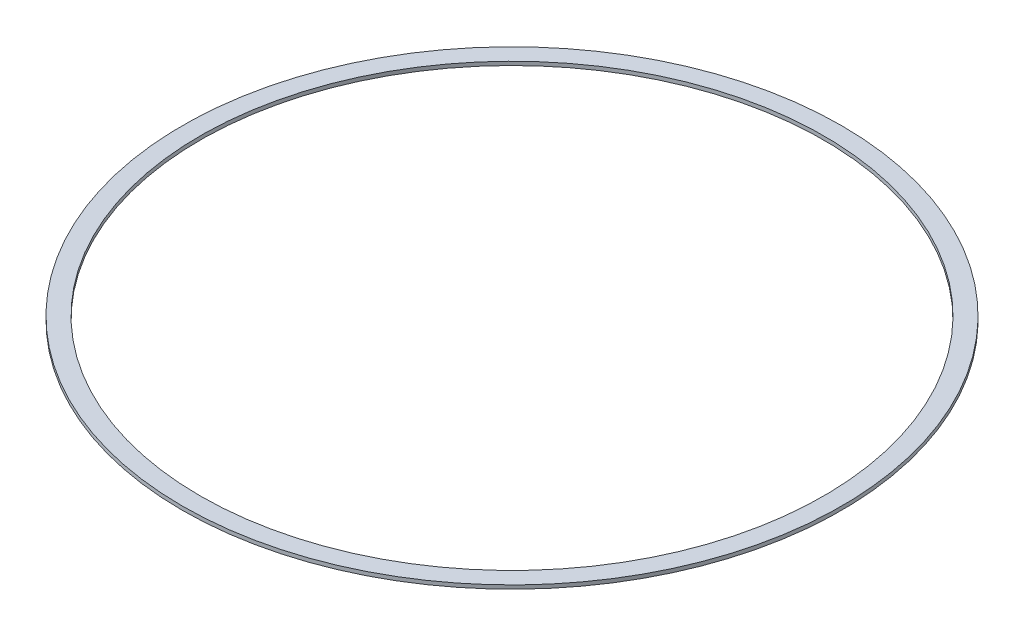
ISO-10303-21;
HEADER;
FILE_DESCRIPTION(('STEP AP214'),'2;1');
FILE_NAME('part.step','',(''),(''),'','','');
FILE_SCHEMA(('AUTOMOTIVE_DESIGN { 1 0 10303 214 1 1 1 1 }'));
ENDSEC;
DATA;
#1=APPLICATION_CONTEXT('core data for automotive mechanical design processes');
#2=APPLICATION_PROTOCOL_DEFINITION('international standard','automotive_design',2000,#1);
#3=PRODUCT_CONTEXT('',#1,'mechanical');
#4=PRODUCT('Part','Part','',(#3));
#5=PRODUCT_RELATED_PRODUCT_CATEGORY('part','',(#4));
#6=PRODUCT_DEFINITION_FORMATION('','',#4);
#7=PRODUCT_DEFINITION_CONTEXT('part definition',#1,'design');
#8=PRODUCT_DEFINITION('design','',#6,#7);
#9=PRODUCT_DEFINITION_SHAPE('','',#8);
#10=(LENGTH_UNIT() NAMED_UNIT(*) SI_UNIT(.MILLI.,.METRE.));
#11=(NAMED_UNIT(*) PLANE_ANGLE_UNIT() SI_UNIT($,.RADIAN.));
#12=(NAMED_UNIT(*) SI_UNIT($,.STERADIAN.) SOLID_ANGLE_UNIT());
#13=UNCERTAINTY_MEASURE_WITH_UNIT(LENGTH_MEASURE(1.E-05),#10,'distance_accuracy_value','');
#14=(GEOMETRIC_REPRESENTATION_CONTEXT(3) GLOBAL_UNCERTAINTY_ASSIGNED_CONTEXT((#13)) GLOBAL_UNIT_ASSIGNED_CONTEXT((#10,
#11,#12)) REPRESENTATION_CONTEXT('',''));
#15=CARTESIAN_POINT('',(0.,0.,0.));
#16=DIRECTION('',(0.,0.,1.));
#17=DIRECTION('',(1.,0.,0.));
#18=AXIS2_PLACEMENT_3D('',#15,#16,#17);
#19=CARTESIAN_POINT('',(0.,2.54,0.));
#20=DIRECTION('',(0.,1.,0.));
#21=DIRECTION('',(0.,0.,1.));
#22=AXIS2_PLACEMENT_3D('',#19,#20,#21);
#23=PLANE('',#22);
#24=CARTESIAN_POINT('',(0.,2.54,0.));
#25=DIRECTION('',(0.,1.,0.));
#26=DIRECTION('',(0.,0.,1.));
#27=AXIS2_PLACEMENT_3D('',#24,#25,#26);
#28=CIRCLE('',#27,224.9678);
#29=CARTESIAN_POINT('',(0.,2.54,224.9678));
#30=VERTEX_POINT('',#29);
#31=EDGE_CURVE('E10',#30,#30,#28,.T.);
#32=ORIENTED_EDGE('',*,*,#31,.T.);
#33=EDGE_LOOP('',(#32));
#34=FACE_BOUND('',#33,.T.);
#35=CARTESIAN_POINT('',(0.,2.54,0.));
#36=DIRECTION('',(0.,1.,0.));
#37=DIRECTION('',(0.,0.,1.));
#38=AXIS2_PLACEMENT_3D('',#35,#36,#37);
#39=CIRCLE('',#38,212.8774);
#40=CARTESIAN_POINT('',(0.,2.54,212.8774));
#41=VERTEX_POINT('',#40);
#42=EDGE_CURVE('E50',#41,#41,#39,.T.);
#43=ORIENTED_EDGE('',*,*,#42,.F.);
#44=EDGE_LOOP('',(#43));
#45=FACE_BOUND('',#44,.T.);
#46=ADVANCED_FACE('F39',(#34,#45),#23,.T.);
#47=CARTESIAN_POINT('',(0.,0.,0.));
#48=DIRECTION('',(0.,1.,0.));
#49=DIRECTION('',(0.,0.,1.));
#50=AXIS2_PLACEMENT_3D('',#47,#48,#49);
#51=PLANE('',#50);
#52=CARTESIAN_POINT('',(0.,0.,0.));
#53=DIRECTION('',(0.,1.,0.));
#54=DIRECTION('',(0.,0.,1.));
#55=AXIS2_PLACEMENT_3D('',#52,#53,#54);
#56=CIRCLE('',#55,224.9678);
#57=CARTESIAN_POINT('',(0.,0.,224.9678));
#58=VERTEX_POINT('',#57);
#59=EDGE_CURVE('E43',#58,#58,#56,.T.);
#60=ORIENTED_EDGE('',*,*,#59,.F.);
#61=EDGE_LOOP('',(#60));
#62=FACE_BOUND('',#61,.T.);
#63=CARTESIAN_POINT('',(0.,0.,0.));
#64=DIRECTION('',(0.,1.,0.));
#65=DIRECTION('',(0.,0.,1.));
#66=AXIS2_PLACEMENT_3D('',#63,#64,#65);
#67=CIRCLE('',#66,212.8774);
#68=CARTESIAN_POINT('',(0.,0.,212.8774));
#69=VERTEX_POINT('',#68);
#70=EDGE_CURVE('E52',#69,#69,#67,.T.);
#71=ORIENTED_EDGE('',*,*,#70,.T.);
#72=EDGE_LOOP('',(#71));
#73=FACE_BOUND('',#72,.T.);
#74=ADVANCED_FACE('F62',(#62,#73),#51,.F.);
#75=CARTESIAN_POINT('',(0.,2.54,0.));
#76=DIRECTION('',(0.,-1.,0.));
#77=DIRECTION('',(0.,0.,-1.));
#78=AXIS2_PLACEMENT_3D('',#75,#76,#77);
#79=CYLINDRICAL_SURFACE('',#78,224.9678);
#80=ORIENTED_EDGE('',*,*,#31,.F.);
#81=EDGE_LOOP('',(#80));
#82=FACE_BOUND('',#81,.T.);
#83=ORIENTED_EDGE('',*,*,#59,.T.);
#84=EDGE_LOOP('',(#83));
#85=FACE_BOUND('',#84,.T.);
#86=ADVANCED_FACE('F41',(#82,#85),#79,.T.);
#87=CARTESIAN_POINT('',(0.,2.54,0.));
#88=DIRECTION('',(0.,-1.,0.));
#89=DIRECTION('',(0.,0.,-1.));
#90=AXIS2_PLACEMENT_3D('',#87,#88,#89);
#91=CYLINDRICAL_SURFACE('',#90,212.8774);
#92=ORIENTED_EDGE('',*,*,#42,.T.);
#93=EDGE_LOOP('',(#92));
#94=FACE_BOUND('',#93,.T.);
#95=ORIENTED_EDGE('',*,*,#70,.F.);
#96=EDGE_LOOP('',(#95));
#97=FACE_BOUND('',#96,.T.);
#98=ADVANCED_FACE('F58',(#94,#97),#91,.F.);
#99=CLOSED_SHELL('',(#46,#74,#86,#98));
#100=MANIFOLD_SOLID_BREP('B2',#99);
#101=ADVANCED_BREP_SHAPE_REPRESENTATION('',(#18,#100),#14);
#102=SHAPE_DEFINITION_REPRESENTATION(#9,#101);
ENDSEC;
END-ISO-10303-21;
